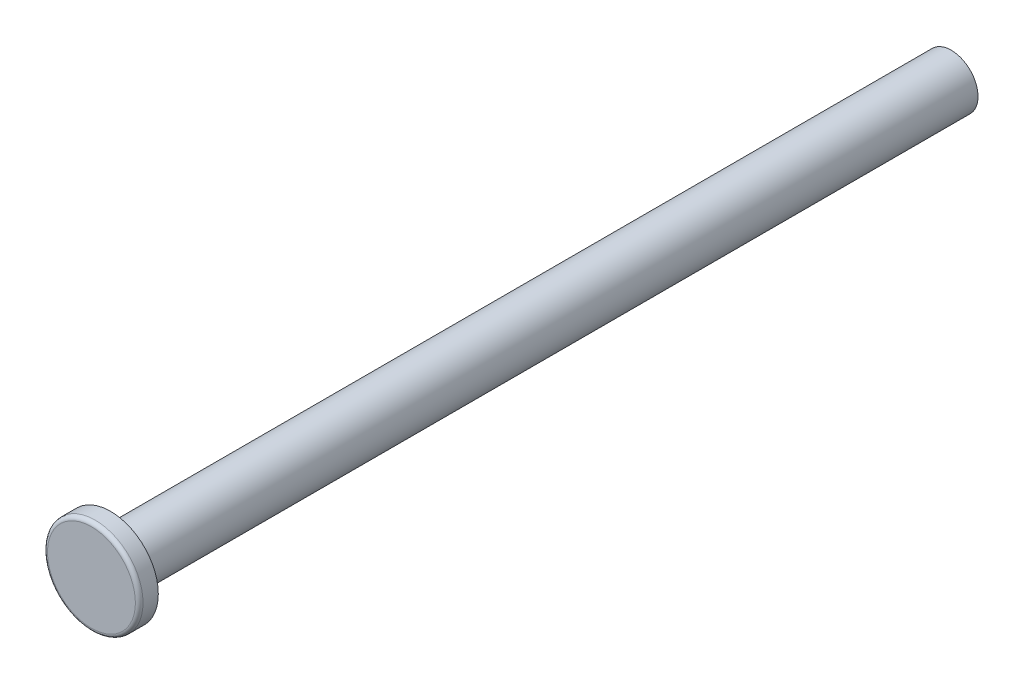
ISO-10303-21;
HEADER;
FILE_DESCRIPTION(('STEP AP214'),'2;1');
FILE_NAME('part.step','',(''),(''),'','','');
FILE_SCHEMA(('AUTOMOTIVE_DESIGN { 1 0 10303 214 1 1 1 1 }'));
ENDSEC;
DATA;
#1=APPLICATION_CONTEXT('core data for automotive mechanical design processes');
#2=APPLICATION_PROTOCOL_DEFINITION('international standard','automotive_design',2000,#1);
#3=PRODUCT_CONTEXT('',#1,'mechanical');
#4=PRODUCT('Part','Part','',(#3));
#5=PRODUCT_RELATED_PRODUCT_CATEGORY('part','',(#4));
#6=PRODUCT_DEFINITION_FORMATION('','',#4);
#7=PRODUCT_DEFINITION_CONTEXT('part definition',#1,'design');
#8=PRODUCT_DEFINITION('design','',#6,#7);
#9=PRODUCT_DEFINITION_SHAPE('','',#8);
#10=(LENGTH_UNIT() NAMED_UNIT(*) SI_UNIT(.MILLI.,.METRE.));
#11=(NAMED_UNIT(*) PLANE_ANGLE_UNIT() SI_UNIT($,.RADIAN.));
#12=(NAMED_UNIT(*) SI_UNIT($,.STERADIAN.) SOLID_ANGLE_UNIT());
#13=UNCERTAINTY_MEASURE_WITH_UNIT(LENGTH_MEASURE(1.E-05),#10,'distance_accuracy_value','');
#14=(GEOMETRIC_REPRESENTATION_CONTEXT(3) GLOBAL_UNCERTAINTY_ASSIGNED_CONTEXT((#13)) GLOBAL_UNIT_ASSIGNED_CONTEXT((#10,
#11,#12)) REPRESENTATION_CONTEXT('',''));
#15=CARTESIAN_POINT('',(0.,0.,0.));
#16=DIRECTION('',(0.,0.,1.));
#17=DIRECTION('',(1.,0.,0.));
#18=AXIS2_PLACEMENT_3D('',#15,#16,#17);
#19=CARTESIAN_POINT('',(0.,0.,110.));
#20=DIRECTION('',(0.,0.,-1.));
#21=DIRECTION('',(-1.,0.,0.));
#22=AXIS2_PLACEMENT_3D('',#19,#20,#21);
#23=CYLINDRICAL_SURFACE('',#22,7.);
#24=CARTESIAN_POINT('',(0.,0.,110.));
#25=DIRECTION('',(0.,0.,1.));
#26=DIRECTION('',(1.,0.,0.));
#27=AXIS2_PLACEMENT_3D('',#24,#25,#26);
#28=CIRCLE('',#27,7.);
#29=CARTESIAN_POINT('',(7.,0.,110.));
#30=VERTEX_POINT('',#29);
#31=EDGE_CURVE('E46',#30,#30,#28,.T.);
#32=ORIENTED_EDGE('',*,*,#31,.F.);
#33=EDGE_LOOP('',(#32));
#34=FACE_BOUND('',#33,.T.);
#35=CARTESIAN_POINT('',(0.,0.,-110.));
#36=DIRECTION('',(0.,0.,1.));
#37=DIRECTION('',(1.,0.,0.));
#38=AXIS2_PLACEMENT_3D('',#35,#36,#37);
#39=CIRCLE('',#38,7.);
#40=CARTESIAN_POINT('',(7.,0.,-110.));
#41=VERTEX_POINT('',#40);
#42=EDGE_CURVE('E50',#41,#41,#39,.T.);
#43=ORIENTED_EDGE('',*,*,#42,.T.);
#44=EDGE_LOOP('',(#43));
#45=FACE_BOUND('',#44,.T.);
#46=ADVANCED_FACE('F35',(#34,#45),#23,.T.);
#47=CARTESIAN_POINT('',(0.,0.,-110.));
#48=DIRECTION('',(0.,0.,1.));
#49=DIRECTION('',(1.,0.,0.));
#50=AXIS2_PLACEMENT_3D('',#47,#48,#49);
#51=PLANE('',#50);
#52=ORIENTED_EDGE('',*,*,#42,.F.);
#53=EDGE_LOOP('',(#52));
#54=FACE_BOUND('',#53,.T.);
#55=ADVANCED_FACE('F75',(#54),#51,.F.);
#56=CARTESIAN_POINT('',(0.,0.,115.));
#57=DIRECTION('',(0.,0.,-1.));
#58=DIRECTION('',(-1.,0.,0.));
#59=AXIS2_PLACEMENT_3D('',#56,#57,#58);
#60=CYLINDRICAL_SURFACE('',#59,12.5);
#61=CARTESIAN_POINT('',(0.,0.,114.));
#62=DIRECTION('',(0.,0.,1.));
#63=DIRECTION('',(1.,0.,0.));
#64=AXIS2_PLACEMENT_3D('',#61,#62,#63);
#65=CIRCLE('',#64,12.5);
#66=CARTESIAN_POINT('',(12.5,0.,114.));
#67=VERTEX_POINT('',#66);
#68=EDGE_CURVE('E10',#67,#67,#65,.F.);
#69=ORIENTED_EDGE('',*,*,#68,.T.);
#70=EDGE_LOOP('',(#69));
#71=FACE_BOUND('',#70,.T.);
#72=CARTESIAN_POINT('',(0.,0.,110.));
#73=DIRECTION('',(0.,0.,1.));
#74=DIRECTION('',(1.,0.,0.));
#75=AXIS2_PLACEMENT_3D('',#72,#73,#74);
#76=CIRCLE('',#75,12.5);
#77=CARTESIAN_POINT('',(12.5,0.,110.));
#78=VERTEX_POINT('',#77);
#79=EDGE_CURVE('E54',#78,#78,#76,.T.);
#80=ORIENTED_EDGE('',*,*,#79,.T.);
#81=EDGE_LOOP('',(#80));
#82=FACE_BOUND('',#81,.T.);
#83=ADVANCED_FACE('F59',(#71,#82),#60,.T.);
#84=CARTESIAN_POINT('',(0.,0.,115.));
#85=DIRECTION('',(0.,0.,1.));
#86=DIRECTION('',(1.,0.,0.));
#87=AXIS2_PLACEMENT_3D('',#84,#85,#86);
#88=PLANE('',#87);
#89=CARTESIAN_POINT('',(0.,0.,115.));
#90=DIRECTION('',(0.,0.,1.));
#91=DIRECTION('',(1.,0.,0.));
#92=AXIS2_PLACEMENT_3D('',#89,#90,#91);
#93=CIRCLE('',#92,11.5);
#94=CARTESIAN_POINT('',(11.5,0.,115.));
#95=VERTEX_POINT('',#94);
#96=EDGE_CURVE('E42',#95,#95,#93,.T.);
#97=ORIENTED_EDGE('',*,*,#96,.T.);
#98=EDGE_LOOP('',(#97));
#99=FACE_BOUND('',#98,.T.);
#100=ADVANCED_FACE('F63',(#99),#88,.T.);
#101=CARTESIAN_POINT('',(0.,0.,110.));
#102=DIRECTION('',(0.,0.,1.));
#103=DIRECTION('',(1.,0.,0.));
#104=AXIS2_PLACEMENT_3D('',#101,#102,#103);
#105=PLANE('',#104);
#106=ORIENTED_EDGE('',*,*,#31,.T.);
#107=EDGE_LOOP('',(#106));
#108=FACE_BOUND('',#107,.T.);
#109=ORIENTED_EDGE('',*,*,#79,.F.);
#110=EDGE_LOOP('',(#109));
#111=FACE_BOUND('',#110,.T.);
#112=ADVANCED_FACE('F61',(#108,#111),#105,.F.);
#113=CARTESIAN_POINT('',(0.,0.,114.));
#114=DIRECTION('',(0.,0.,1.));
#115=DIRECTION('',(1.,0.,0.));
#116=AXIS2_PLACEMENT_3D('',#113,#114,#115);
#117=TOROIDAL_SURFACE('',#116,11.5,1.);
#118=ORIENTED_EDGE('',*,*,#68,.F.);
#119=EDGE_LOOP('',(#118));
#120=FACE_BOUND('',#119,.T.);
#121=ORIENTED_EDGE('',*,*,#96,.F.);
#122=EDGE_LOOP('',(#121));
#123=FACE_BOUND('',#122,.T.);
#124=ADVANCED_FACE('F37',(#120,#123),#117,.T.);
#125=CLOSED_SHELL('',(#46,#55,#83,#100,#112,#124));
#126=MANIFOLD_SOLID_BREP('B2',#125);
#127=ADVANCED_BREP_SHAPE_REPRESENTATION('',(#18,#126),#14);
#128=SHAPE_DEFINITION_REPRESENTATION(#9,#127);
ENDSEC;
END-ISO-10303-21;
